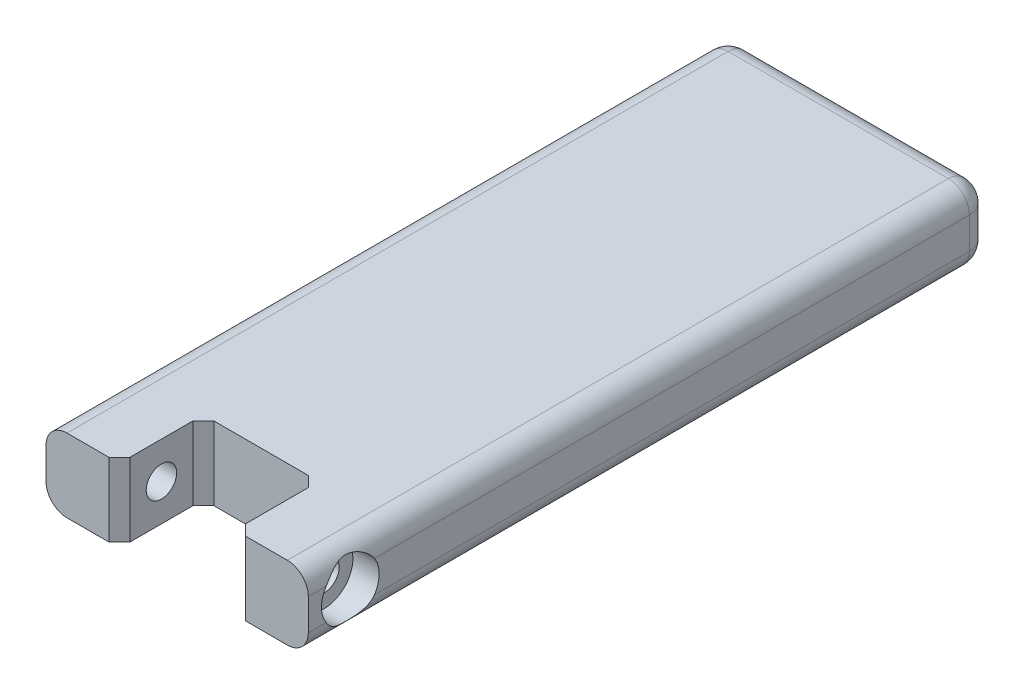
ISO-10303-21;
HEADER;
FILE_DESCRIPTION(('STEP AP214'),'2;1');
FILE_NAME('part.step','',(''),(''),'','','');
FILE_SCHEMA(('AUTOMOTIVE_DESIGN { 1 0 10303 214 1 1 1 1 }'));
ENDSEC;
DATA;
#1=APPLICATION_CONTEXT('core data for automotive mechanical design processes');
#2=APPLICATION_PROTOCOL_DEFINITION('international standard','automotive_design',2000,#1);
#3=PRODUCT_CONTEXT('',#1,'mechanical');
#4=PRODUCT('Part','Part','',(#3));
#5=PRODUCT_RELATED_PRODUCT_CATEGORY('part','',(#4));
#6=PRODUCT_DEFINITION_FORMATION('','',#4);
#7=PRODUCT_DEFINITION_CONTEXT('part definition',#1,'design');
#8=PRODUCT_DEFINITION('design','',#6,#7);
#9=PRODUCT_DEFINITION_SHAPE('','',#8);
#10=(LENGTH_UNIT() NAMED_UNIT(*) SI_UNIT(.MILLI.,.METRE.));
#11=(NAMED_UNIT(*) PLANE_ANGLE_UNIT() SI_UNIT($,.RADIAN.));
#12=(NAMED_UNIT(*) SI_UNIT($,.STERADIAN.) SOLID_ANGLE_UNIT());
#13=UNCERTAINTY_MEASURE_WITH_UNIT(LENGTH_MEASURE(1.E-05),#10,'distance_accuracy_value','');
#14=(GEOMETRIC_REPRESENTATION_CONTEXT(3) GLOBAL_UNCERTAINTY_ASSIGNED_CONTEXT((#13)) GLOBAL_UNIT_ASSIGNED_CONTEXT((#10,
#11,#12)) REPRESENTATION_CONTEXT('',''));
#15=CARTESIAN_POINT('',(0.,0.,0.));
#16=DIRECTION('',(0.,0.,1.));
#17=DIRECTION('',(1.,0.,0.));
#18=AXIS2_PLACEMENT_3D('',#15,#16,#17);
#19=CARTESIAN_POINT('',(12.5,-3.5,65.));
#20=DIRECTION('',(-1.,0.,0.));
#21=DIRECTION('',(0.,0.,1.));
#22=AXIS2_PLACEMENT_3D('',#19,#20,#21);
#23=PLANE('',#22);
#24=DIRECTION('',(0.,0.,-1.));
#25=VECTOR('',#24,1.);
#26=CARTESIAN_POINT('',(12.5,-1.5,65.));
#27=LINE('',#26,#25);
#28=CARTESIAN_POINT('',(12.5,-1.5,58.6951138856773));
#29=VERTEX_POINT('',#28);
#30=CARTESIAN_POINT('',(12.5,-1.5,2.));
#31=VERTEX_POINT('',#30);
#32=EDGE_CURVE('E250',#29,#31,#27,.T.);
#33=ORIENTED_EDGE('',*,*,#32,.T.);
#34=DIRECTION('',(0.,1.,0.));
#35=VECTOR('',#34,1.);
#36=CARTESIAN_POINT('',(12.5,1.5,2.));
#37=LINE('',#36,#35);
#38=CARTESIAN_POINT('',(12.5,1.5,2.));
#39=VERTEX_POINT('',#38);
#40=EDGE_CURVE('E355',#31,#39,#37,.T.);
#41=ORIENTED_EDGE('',*,*,#40,.T.);
#42=DIRECTION('',(0.,0.,-1.));
#43=VECTOR('',#42,1.);
#44=CARTESIAN_POINT('',(12.5,1.5,65.));
#45=LINE('',#44,#43);
#46=CARTESIAN_POINT('',(12.5,1.5,58.6951138856773));
#47=VERTEX_POINT('',#46);
#48=EDGE_CURVE('E258',#39,#47,#45,.F.);
#49=ORIENTED_EDGE('',*,*,#48,.T.);
#50=CARTESIAN_POINT('',(12.5,0.,61.0000000000006));
#51=DIRECTION('',(1.,0.,0.));
#52=DIRECTION('',(0.,0.,-1.));
#53=AXIS2_PLACEMENT_3D('',#50,#51,#52);
#54=CIRCLE('',#53,2.75);
#55=EDGE_CURVE('E358',#29,#47,#54,.T.);
#56=ORIENTED_EDGE('',*,*,#55,.F.);
#57=EDGE_LOOP('',(#33,#41,#49,#56));
#58=FACE_BOUND('',#57,.T.);
#59=ADVANCED_FACE('F35',(#58),#23,.F.);
#60=CARTESIAN_POINT('',(0.,0.,65.));
#61=DIRECTION('',(0.,0.,-1.));
#62=DIRECTION('',(-1.,0.,0.));
#63=AXIS2_PLACEMENT_3D('',#60,#61,#62);
#64=PLANE('',#63);
#65=DIRECTION('',(1.,0.,0.));
#66=VECTOR('',#65,1.);
#67=CARTESIAN_POINT('',(-12.5,-3.5,65.));
#68=LINE('',#67,#66);
#69=CARTESIAN_POINT('',(-10.5,-3.5,65.));
#70=VERTEX_POINT('',#69);
#71=CARTESIAN_POINT('',(-6.50000000000001,-3.5,65.));
#72=VERTEX_POINT('',#71);
#73=EDGE_CURVE('E220',#70,#72,#68,.T.);
#74=ORIENTED_EDGE('',*,*,#73,.T.);
#75=DIRECTION('',(0.,1.,0.));
#76=VECTOR('',#75,1.);
#77=CARTESIAN_POINT('',(-6.50000000000001,0.,65.));
#78=LINE('',#77,#76);
#79=CARTESIAN_POINT('',(-6.50000000000001,3.5,65.));
#80=VERTEX_POINT('',#79);
#81=EDGE_CURVE('E43',#72,#80,#78,.T.);
#82=ORIENTED_EDGE('',*,*,#81,.T.);
#83=DIRECTION('',(-1.,0.,0.));
#84=VECTOR('',#83,1.);
#85=CARTESIAN_POINT('',(-12.5,3.5,65.));
#86=LINE('',#85,#84);
#87=CARTESIAN_POINT('',(-10.5,3.5,65.));
#88=VERTEX_POINT('',#87);
#89=EDGE_CURVE('E212',#80,#88,#86,.T.);
#90=ORIENTED_EDGE('',*,*,#89,.T.);
#91=CARTESIAN_POINT('',(-10.5,1.5,65.));
#92=DIRECTION('',(0.,0.,-1.));
#93=DIRECTION('',(-1.,0.,0.));
#94=AXIS2_PLACEMENT_3D('',#91,#92,#93);
#95=CIRCLE('',#94,2.);
#96=CARTESIAN_POINT('',(-12.5,1.5,65.));
#97=VERTEX_POINT('',#96);
#98=EDGE_CURVE('E248',#88,#97,#95,.F.);
#99=ORIENTED_EDGE('',*,*,#98,.T.);
#100=DIRECTION('',(0.,-1.,0.));
#101=VECTOR('',#100,1.);
#102=CARTESIAN_POINT('',(-12.5,-3.5,65.));
#103=LINE('',#102,#101);
#104=CARTESIAN_POINT('',(-12.5,-1.5,65.));
#105=VERTEX_POINT('',#104);
#106=EDGE_CURVE('E216',#97,#105,#103,.T.);
#107=ORIENTED_EDGE('',*,*,#106,.T.);
#108=CARTESIAN_POINT('',(-10.5,-1.5,65.));
#109=DIRECTION('',(0.,0.,-1.));
#110=DIRECTION('',(-1.,0.,0.));
#111=AXIS2_PLACEMENT_3D('',#108,#109,#110);
#112=CIRCLE('',#111,2.);
#113=EDGE_CURVE('E246',#105,#70,#112,.F.);
#114=ORIENTED_EDGE('',*,*,#113,.T.);
#115=EDGE_LOOP('',(#74,#82,#90,#99,#107,#114));
#116=FACE_BOUND('',#115,.T.);
#117=ADVANCED_FACE('F310',(#116),#64,.F.);
#118=CARTESIAN_POINT('',(12.5,1.5,63.3048861143238));
#119=VERTEX_POINT('',#118);
#120=CARTESIAN_POINT('',(12.5,-1.5,63.3048861143238));
#121=VERTEX_POINT('',#120);
#122=EDGE_CURVE('E476',#119,#121,#54,.T.);
#123=ORIENTED_EDGE('',*,*,#122,.F.);
#124=DIRECTION('',(0.,0.,-1.));
#125=VECTOR('',#124,1.);
#126=CARTESIAN_POINT('',(12.5,1.5,65.));
#127=LINE('',#126,#125);
#128=CARTESIAN_POINT('',(12.5,1.5,65.));
#129=VERTEX_POINT('',#128);
#130=EDGE_CURVE('E256',#119,#129,#127,.F.);
#131=ORIENTED_EDGE('',*,*,#130,.T.);
#132=DIRECTION('',(0.,1.,0.));
#133=VECTOR('',#132,1.);
#134=CARTESIAN_POINT('',(12.5,-3.5,65.));
#135=LINE('',#134,#133);
#136=CARTESIAN_POINT('',(12.5,-1.5,65.));
#137=VERTEX_POINT('',#136);
#138=EDGE_CURVE('E209',#137,#129,#135,.T.);
#139=ORIENTED_EDGE('',*,*,#138,.F.);
#140=DIRECTION('',(0.,0.,-1.));
#141=VECTOR('',#140,1.);
#142=CARTESIAN_POINT('',(12.5,-1.5,65.));
#143=LINE('',#142,#141);
#144=EDGE_CURVE('E253',#137,#121,#143,.T.);
#145=ORIENTED_EDGE('',*,*,#144,.T.);
#146=EDGE_LOOP('',(#123,#131,#139,#145));
#147=FACE_BOUND('',#146,.T.);
#148=ADVANCED_FACE('F322',(#147),#23,.F.);
#149=CARTESIAN_POINT('',(-12.5,3.5,65.));
#150=DIRECTION('',(0.,-1.,0.));
#151=DIRECTION('',(0.,0.,-1.));
#152=AXIS2_PLACEMENT_3D('',#149,#150,#151);
#153=PLANE('',#152);
#154=DIRECTION('',(0.,0.,-1.));
#155=VECTOR('',#154,1.);
#156=CARTESIAN_POINT('',(5.5,3.5,65.));
#157=LINE('',#156,#155);
#158=CARTESIAN_POINT('',(5.5,3.5,64.));
#159=VERTEX_POINT('',#158);
#160=CARTESIAN_POINT('',(5.5,3.5,58.));
#161=VERTEX_POINT('',#160);
#162=EDGE_CURVE('E201',#159,#161,#157,.T.);
#163=ORIENTED_EDGE('',*,*,#162,.F.);
#164=DIRECTION('',(-0.707106781186545,0.,-0.70710678118655));
#165=VECTOR('',#164,1.);
#166=CARTESIAN_POINT('',(5.5,3.5,64.));
#167=LINE('',#166,#165);
#168=CARTESIAN_POINT('',(6.49999999999999,3.5,65.));
#169=VERTEX_POINT('',#168);
#170=EDGE_CURVE('E394',#159,#169,#167,.F.);
#171=ORIENTED_EDGE('',*,*,#170,.T.);
#172=CARTESIAN_POINT('',(10.5,3.5,65.));
#173=VERTEX_POINT('',#172);
#174=EDGE_CURVE('E213',#173,#169,#86,.T.);
#175=ORIENTED_EDGE('',*,*,#174,.F.);
#176=DIRECTION('',(0.,0.,-1.));
#177=VECTOR('',#176,1.);
#178=CARTESIAN_POINT('',(10.5,3.5,65.));
#179=LINE('',#178,#177);
#180=CARTESIAN_POINT('',(10.5,3.5,2.));
#181=VERTEX_POINT('',#180);
#182=EDGE_CURVE('E240',#173,#181,#179,.T.);
#183=ORIENTED_EDGE('',*,*,#182,.T.);
#184=DIRECTION('',(-1.,0.,0.));
#185=VECTOR('',#184,1.);
#186=CARTESIAN_POINT('',(-10.5,3.5,2.));
#187=LINE('',#186,#185);
#188=CARTESIAN_POINT('',(-10.5,3.5,2.));
#189=VERTEX_POINT('',#188);
#190=EDGE_CURVE('E407',#181,#189,#187,.T.);
#191=ORIENTED_EDGE('',*,*,#190,.T.);
#192=DIRECTION('',(0.,0.,-1.));
#193=VECTOR('',#192,1.);
#194=CARTESIAN_POINT('',(-10.5,3.5,65.));
#195=LINE('',#194,#193);
#196=EDGE_CURVE('E243',#189,#88,#195,.F.);
#197=ORIENTED_EDGE('',*,*,#196,.T.);
#198=ORIENTED_EDGE('',*,*,#89,.F.);
#199=DIRECTION('',(-0.70710678118654,0.,0.707106781186555));
#200=VECTOR('',#199,1.);
#201=CARTESIAN_POINT('',(-6.50000000000001,3.5,65.));
#202=LINE('',#201,#200);
#203=CARTESIAN_POINT('',(-5.50000000000001,3.5,64.));
#204=VERTEX_POINT('',#203);
#205=EDGE_CURVE('E391',#80,#204,#202,.F.);
#206=ORIENTED_EDGE('',*,*,#205,.T.);
#207=DIRECTION('',(0.,0.,1.));
#208=VECTOR('',#207,1.);
#209=CARTESIAN_POINT('',(-5.50000000000001,3.5,65.));
#210=LINE('',#209,#208);
#211=CARTESIAN_POINT('',(-5.50000000000001,3.5,58.));
#212=VERTEX_POINT('',#211);
#213=EDGE_CURVE('E205',#212,#204,#210,.T.);
#214=ORIENTED_EDGE('',*,*,#213,.F.);
#215=DIRECTION('',(-0.707106781186545,0.,0.70710678118655));
#216=VECTOR('',#215,1.);
#217=CARTESIAN_POINT('',(-12.5,3.5,65.));
#218=LINE('',#217,#216);
#219=CARTESIAN_POINT('',(-4.50000000000001,3.5,57.));
#220=VERTEX_POINT('',#219);
#221=EDGE_CURVE('E199',#212,#220,#218,.F.);
#222=ORIENTED_EDGE('',*,*,#221,.T.);
#223=DIRECTION('',(-1.,0.,0.));
#224=VECTOR('',#223,1.);
#225=CARTESIAN_POINT('',(-5.50000000000001,3.5,57.));
#226=LINE('',#225,#224);
#227=CARTESIAN_POINT('',(4.49999999999999,3.5,57.));
#228=VERTEX_POINT('',#227);
#229=EDGE_CURVE('E191',#228,#220,#226,.T.);
#230=ORIENTED_EDGE('',*,*,#229,.F.);
#231=DIRECTION('',(-0.70710678118655,0.,-0.707106781186545));
#232=VECTOR('',#231,1.);
#233=CARTESIAN_POINT('',(0.,3.5,52.5));
#234=LINE('',#233,#232);
#235=EDGE_CURVE('E174',#228,#161,#234,.F.);
#236=ORIENTED_EDGE('',*,*,#235,.T.);
#237=EDGE_LOOP('',(#163,#171,#175,#183,#191,#197,#198,#206,#214,#222,#230,#236));
#238=FACE_BOUND('',#237,.T.);
#239=ADVANCED_FACE('F197',(#238),#153,.F.);
#240=CARTESIAN_POINT('',(-12.5,-3.5,65.));
#241=DIRECTION('',(1.,0.,0.));
#242=DIRECTION('',(0.,0.,-1.));
#243=AXIS2_PLACEMENT_3D('',#240,#241,#242);
#244=PLANE('',#243);
#245=CARTESIAN_POINT('',(-12.5,0.,61.0000000000006));
#246=DIRECTION('',(1.,0.,0.));
#247=DIRECTION('',(0.,0.,-1.));
#248=AXIS2_PLACEMENT_3D('',#245,#246,#247);
#249=CIRCLE('',#248,1.44999999999999);
#250=CARTESIAN_POINT('',(-12.5,0.,59.5500000000006));
#251=VERTEX_POINT('',#250);
#252=EDGE_CURVE('E235',#251,#251,#249,.T.);
#253=ORIENTED_EDGE('',*,*,#252,.T.);
#254=EDGE_LOOP('',(#253));
#255=FACE_BOUND('',#254,.T.);
#256=DIRECTION('',(0.,0.,-1.));
#257=VECTOR('',#256,1.);
#258=CARTESIAN_POINT('',(-12.5,1.5,65.));
#259=LINE('',#258,#257);
#260=CARTESIAN_POINT('',(-12.5,1.5,2.));
#261=VERTEX_POINT('',#260);
#262=EDGE_CURVE('E237',#97,#261,#259,.T.);
#263=ORIENTED_EDGE('',*,*,#262,.T.);
#264=DIRECTION('',(0.,-1.,0.));
#265=VECTOR('',#264,1.);
#266=CARTESIAN_POINT('',(-12.5,-1.5,2.));
#267=LINE('',#266,#265);
#268=CARTESIAN_POINT('',(-12.5,-1.5,2.));
#269=VERTEX_POINT('',#268);
#270=EDGE_CURVE('E392',#261,#269,#267,.T.);
#271=ORIENTED_EDGE('',*,*,#270,.T.);
#272=DIRECTION('',(0.,0.,-1.));
#273=VECTOR('',#272,1.);
#274=CARTESIAN_POINT('',(-12.5,-1.5,65.));
#275=LINE('',#274,#273);
#276=EDGE_CURVE('E230',#269,#105,#275,.F.);
#277=ORIENTED_EDGE('',*,*,#276,.T.);
#278=ORIENTED_EDGE('',*,*,#106,.F.);
#279=EDGE_LOOP('',(#263,#271,#277,#278));
#280=FACE_BOUND('',#279,.T.);
#281=ADVANCED_FACE('F316',(#255,#280),#244,.F.);
#282=CARTESIAN_POINT('',(-12.5,-3.5,65.));
#283=DIRECTION('',(0.,1.,0.));
#284=DIRECTION('',(0.,0.,1.));
#285=AXIS2_PLACEMENT_3D('',#282,#283,#284);
#286=PLANE('',#285);
#287=CARTESIAN_POINT('',(6.49999999999999,-3.5,65.));
#288=VERTEX_POINT('',#287);
#289=CARTESIAN_POINT('',(10.5,-3.5,65.));
#290=VERTEX_POINT('',#289);
#291=EDGE_CURVE('E219',#288,#290,#68,.T.);
#292=ORIENTED_EDGE('',*,*,#291,.F.);
#293=DIRECTION('',(0.707106781186545,0.,0.70710678118655));
#294=VECTOR('',#293,1.);
#295=CARTESIAN_POINT('',(5.5,-3.5,64.));
#296=LINE('',#295,#294);
#297=CARTESIAN_POINT('',(5.5,-3.5,64.));
#298=VERTEX_POINT('',#297);
#299=EDGE_CURVE('E399',#288,#298,#296,.F.);
#300=ORIENTED_EDGE('',*,*,#299,.T.);
#301=DIRECTION('',(0.,0.,-1.));
#302=VECTOR('',#301,1.);
#303=CARTESIAN_POINT('',(5.5,-3.5,65.));
#304=LINE('',#303,#302);
#305=CARTESIAN_POINT('',(5.5,-3.5,58.));
#306=VERTEX_POINT('',#305);
#307=EDGE_CURVE('E203',#298,#306,#304,.T.);
#308=ORIENTED_EDGE('',*,*,#307,.T.);
#309=DIRECTION('',(0.70710678118655,0.,0.707106781186545));
#310=VECTOR('',#309,1.);
#311=CARTESIAN_POINT('',(0.,-3.5,52.5));
#312=LINE('',#311,#310);
#313=CARTESIAN_POINT('',(4.49999999999999,-3.5,57.));
#314=VERTEX_POINT('',#313);
#315=EDGE_CURVE('E184',#306,#314,#312,.F.);
#316=ORIENTED_EDGE('',*,*,#315,.T.);
#317=DIRECTION('',(-1.,0.,0.));
#318=VECTOR('',#317,1.);
#319=CARTESIAN_POINT('',(-5.50000000000001,-3.5,57.));
#320=LINE('',#319,#318);
#321=CARTESIAN_POINT('',(-4.50000000000001,-3.5,57.));
#322=VERTEX_POINT('',#321);
#323=EDGE_CURVE('E194',#314,#322,#320,.T.);
#324=ORIENTED_EDGE('',*,*,#323,.T.);
#325=DIRECTION('',(0.707106781186545,0.,-0.70710678118655));
#326=VECTOR('',#325,1.);
#327=CARTESIAN_POINT('',(-12.5,-3.5,65.));
#328=LINE('',#327,#326);
#329=CARTESIAN_POINT('',(-5.50000000000001,-3.5,58.));
#330=VERTEX_POINT('',#329);
#331=EDGE_CURVE('E228',#322,#330,#328,.F.);
#332=ORIENTED_EDGE('',*,*,#331,.T.);
#333=DIRECTION('',(0.,0.,1.));
#334=VECTOR('',#333,1.);
#335=CARTESIAN_POINT('',(-5.50000000000001,-3.5,65.));
#336=LINE('',#335,#334);
#337=CARTESIAN_POINT('',(-5.50000000000001,-3.5,64.));
#338=VERTEX_POINT('',#337);
#339=EDGE_CURVE('E200',#330,#338,#336,.T.);
#340=ORIENTED_EDGE('',*,*,#339,.T.);
#341=DIRECTION('',(0.70710678118654,0.,-0.707106781186555));
#342=VECTOR('',#341,1.);
#343=CARTESIAN_POINT('',(-6.50000000000001,-3.5,65.));
#344=LINE('',#343,#342);
#345=EDGE_CURVE('E50',#338,#72,#344,.F.);
#346=ORIENTED_EDGE('',*,*,#345,.T.);
#347=ORIENTED_EDGE('',*,*,#73,.F.);
#348=DIRECTION('',(0.,0.,-1.));
#349=VECTOR('',#348,1.);
#350=CARTESIAN_POINT('',(-10.5,-3.5,65.));
#351=LINE('',#350,#349);
#352=CARTESIAN_POINT('',(-10.5,-3.5,2.));
#353=VERTEX_POINT('',#352);
#354=EDGE_CURVE('E428',#70,#353,#351,.T.);
#355=ORIENTED_EDGE('',*,*,#354,.T.);
#356=DIRECTION('',(1.,0.,0.));
#357=VECTOR('',#356,1.);
#358=CARTESIAN_POINT('',(10.5,-3.5,2.));
#359=LINE('',#358,#357);
#360=CARTESIAN_POINT('',(10.5,-3.5,2.));
#361=VERTEX_POINT('',#360);
#362=EDGE_CURVE('E427',#353,#361,#359,.T.);
#363=ORIENTED_EDGE('',*,*,#362,.T.);
#364=DIRECTION('',(0.,0.,-1.));
#365=VECTOR('',#364,1.);
#366=CARTESIAN_POINT('',(10.5,-3.5,65.));
#367=LINE('',#366,#365);
#368=EDGE_CURVE('E465',#361,#290,#367,.F.);
#369=ORIENTED_EDGE('',*,*,#368,.T.);
#370=EDGE_LOOP('',(#292,#300,#308,#316,#324,#332,#340,#346,#347,#355,#363,#369));
#371=FACE_BOUND('',#370,.T.);
#372=ADVANCED_FACE('F308',(#371),#286,.F.);
#373=ORIENTED_EDGE('',*,*,#174,.T.);
#374=DIRECTION('',(0.,-1.,0.));
#375=VECTOR('',#374,1.);
#376=CARTESIAN_POINT('',(6.49999999999999,0.,65.));
#377=LINE('',#376,#375);
#378=EDGE_CURVE('E396',#169,#288,#377,.T.);
#379=ORIENTED_EDGE('',*,*,#378,.T.);
#380=ORIENTED_EDGE('',*,*,#291,.T.);
#381=CARTESIAN_POINT('',(10.5,-1.5,65.));
#382=DIRECTION('',(0.,0.,-1.));
#383=DIRECTION('',(-1.,0.,0.));
#384=AXIS2_PLACEMENT_3D('',#381,#382,#383);
#385=CIRCLE('',#384,2.);
#386=EDGE_CURVE('E469',#290,#137,#385,.F.);
#387=ORIENTED_EDGE('',*,*,#386,.T.);
#388=ORIENTED_EDGE('',*,*,#138,.T.);
#389=CARTESIAN_POINT('',(10.5,1.5,65.));
#390=DIRECTION('',(0.,0.,-1.));
#391=DIRECTION('',(-1.,0.,0.));
#392=AXIS2_PLACEMENT_3D('',#389,#390,#391);
#393=CIRCLE('',#392,2.);
#394=EDGE_CURVE('E468',#129,#173,#393,.F.);
#395=ORIENTED_EDGE('',*,*,#394,.T.);
#396=EDGE_LOOP('',(#373,#379,#380,#387,#388,#395));
#397=FACE_BOUND('',#396,.T.);
#398=ADVANCED_FACE('F305',(#397),#64,.F.);
#399=CARTESIAN_POINT('',(0.,0.,0.));
#400=DIRECTION('',(0.,0.,-1.));
#401=DIRECTION('',(-1.,0.,0.));
#402=AXIS2_PLACEMENT_3D('',#399,#400,#401);
#403=PLANE('',#402);
#404=DIRECTION('',(0.,1.,0.));
#405=VECTOR('',#404,1.);
#406=CARTESIAN_POINT('',(10.5,-1.5,0.));
#407=LINE('',#406,#405);
#408=CARTESIAN_POINT('',(10.5,1.5,0.));
#409=VERTEX_POINT('',#408);
#410=CARTESIAN_POINT('',(10.5,-1.5,0.));
#411=VERTEX_POINT('',#410);
#412=EDGE_CURVE('E445',#409,#411,#407,.F.);
#413=ORIENTED_EDGE('',*,*,#412,.T.);
#414=DIRECTION('',(1.,0.,0.));
#415=VECTOR('',#414,1.);
#416=CARTESIAN_POINT('',(-10.5,-1.5,0.));
#417=LINE('',#416,#415);
#418=CARTESIAN_POINT('',(-10.5,-1.5,0.));
#419=VERTEX_POINT('',#418);
#420=EDGE_CURVE('E444',#411,#419,#417,.F.);
#421=ORIENTED_EDGE('',*,*,#420,.T.);
#422=DIRECTION('',(0.,-1.,0.));
#423=VECTOR('',#422,1.);
#424=CARTESIAN_POINT('',(-10.5,1.5,0.));
#425=LINE('',#424,#423);
#426=CARTESIAN_POINT('',(-10.5,1.5,0.));
#427=VERTEX_POINT('',#426);
#428=EDGE_CURVE('E434',#419,#427,#425,.F.);
#429=ORIENTED_EDGE('',*,*,#428,.T.);
#430=DIRECTION('',(-1.,0.,0.));
#431=VECTOR('',#430,1.);
#432=CARTESIAN_POINT('',(10.5,1.5,0.));
#433=LINE('',#432,#431);
#434=EDGE_CURVE('E448',#427,#409,#433,.F.);
#435=ORIENTED_EDGE('',*,*,#434,.T.);
#436=EDGE_LOOP('',(#413,#421,#429,#435));
#437=FACE_BOUND('',#436,.T.);
#438=ADVANCED_FACE('F303',(#437),#403,.T.);
#439=CARTESIAN_POINT('',(-5.50000000000001,-3.5,65.));
#440=DIRECTION('',(-1.,0.,0.));
#441=DIRECTION('',(0.,0.,1.));
#442=AXIS2_PLACEMENT_3D('',#439,#440,#441);
#443=PLANE('',#442);
#444=CARTESIAN_POINT('',(-5.50000000000001,0.,61.0000000000006));
#445=DIRECTION('',(-1.,0.,0.));
#446=DIRECTION('',(0.,0.,1.));
#447=AXIS2_PLACEMENT_3D('',#444,#445,#446);
#448=CIRCLE('',#447,1.45);
#449=CARTESIAN_POINT('',(-5.50000000000001,0.,62.4500000000006));
#450=VERTEX_POINT('',#449);
#451=EDGE_CURVE('E234',#450,#450,#448,.T.);
#452=ORIENTED_EDGE('',*,*,#451,.T.);
#453=EDGE_LOOP('',(#452));
#454=FACE_BOUND('',#453,.T.);
#455=ORIENTED_EDGE('',*,*,#213,.T.);
#456=DIRECTION('',(0.,-1.,0.));
#457=VECTOR('',#456,1.);
#458=CARTESIAN_POINT('',(-5.50000000000001,-3.5,64.));
#459=LINE('',#458,#457);
#460=EDGE_CURVE('E11',#204,#338,#459,.T.);
#461=ORIENTED_EDGE('',*,*,#460,.T.);
#462=ORIENTED_EDGE('',*,*,#339,.F.);
#463=DIRECTION('',(0.,1.,0.));
#464=VECTOR('',#463,1.);
#465=CARTESIAN_POINT('',(-5.50000000000001,3.5,58.));
#466=LINE('',#465,#464);
#467=EDGE_CURVE('E185',#330,#212,#466,.T.);
#468=ORIENTED_EDGE('',*,*,#467,.T.);
#469=EDGE_LOOP('',(#455,#461,#462,#468));
#470=FACE_BOUND('',#469,.T.);
#471=ADVANCED_FACE('F297',(#454,#470),#443,.F.);
#472=CARTESIAN_POINT('',(-5.50000000000001,-3.5,57.));
#473=DIRECTION('',(0.,0.,-1.));
#474=DIRECTION('',(-1.,0.,0.));
#475=AXIS2_PLACEMENT_3D('',#472,#473,#474);
#476=PLANE('',#475);
#477=ORIENTED_EDGE('',*,*,#323,.F.);
#478=DIRECTION('',(0.,1.,0.));
#479=VECTOR('',#478,1.);
#480=CARTESIAN_POINT('',(4.49999999999999,3.5,57.));
#481=LINE('',#480,#479);
#482=EDGE_CURVE('E178',#314,#228,#481,.T.);
#483=ORIENTED_EDGE('',*,*,#482,.T.);
#484=ORIENTED_EDGE('',*,*,#229,.T.);
#485=DIRECTION('',(0.,-1.,0.));
#486=VECTOR('',#485,1.);
#487=CARTESIAN_POINT('',(-4.50000000000001,-3.5,57.));
#488=LINE('',#487,#486);
#489=EDGE_CURVE('E195',#220,#322,#488,.T.);
#490=ORIENTED_EDGE('',*,*,#489,.T.);
#491=EDGE_LOOP('',(#477,#483,#484,#490));
#492=FACE_BOUND('',#491,.T.);
#493=ADVANCED_FACE('F190',(#492),#476,.F.);
#494=CARTESIAN_POINT('',(5.5,-3.5,65.));
#495=DIRECTION('',(1.,0.,0.));
#496=DIRECTION('',(0.,0.,-1.));
#497=AXIS2_PLACEMENT_3D('',#494,#495,#496);
#498=PLANE('',#497);
#499=CARTESIAN_POINT('',(5.5,0.,61.0000000000006));
#500=DIRECTION('',(1.,0.,0.));
#501=DIRECTION('',(0.,0.,-1.));
#502=AXIS2_PLACEMENT_3D('',#499,#500,#501);
#503=CIRCLE('',#502,1.45);
#504=CARTESIAN_POINT('',(5.5,0.,59.5500000000006));
#505=VERTEX_POINT('',#504);
#506=EDGE_CURVE('E231',#505,#505,#503,.T.);
#507=ORIENTED_EDGE('',*,*,#506,.T.);
#508=EDGE_LOOP('',(#507));
#509=FACE_BOUND('',#508,.T.);
#510=ORIENTED_EDGE('',*,*,#307,.F.);
#511=DIRECTION('',(0.,1.,0.));
#512=VECTOR('',#511,1.);
#513=CARTESIAN_POINT('',(5.5,-3.5,64.));
#514=LINE('',#513,#512);
#515=EDGE_CURVE('E388',#298,#159,#514,.T.);
#516=ORIENTED_EDGE('',*,*,#515,.T.);
#517=ORIENTED_EDGE('',*,*,#162,.T.);
#518=DIRECTION('',(0.,-1.,0.));
#519=VECTOR('',#518,1.);
#520=CARTESIAN_POINT('',(5.5,-3.5,58.));
#521=LINE('',#520,#519);
#522=EDGE_CURVE('E180',#161,#306,#521,.T.);
#523=ORIENTED_EDGE('',*,*,#522,.T.);
#524=EDGE_LOOP('',(#510,#516,#517,#523));
#525=FACE_BOUND('',#524,.T.);
#526=ADVANCED_FACE('F296',(#509,#525),#498,.F.);
#527=CARTESIAN_POINT('',(4.49999999999999,-3.5,57.));
#528=DIRECTION('',(-0.707106781186545,0.,0.70710678118655));
#529=DIRECTION('',(0.,-1.,0.));
#530=AXIS2_PLACEMENT_3D('',#527,#528,#529);
#531=PLANE('',#530);
#532=ORIENTED_EDGE('',*,*,#315,.F.);
#533=ORIENTED_EDGE('',*,*,#522,.F.);
#534=ORIENTED_EDGE('',*,*,#235,.F.);
#535=ORIENTED_EDGE('',*,*,#482,.F.);
#536=EDGE_LOOP('',(#532,#533,#534,#535));
#537=FACE_BOUND('',#536,.T.);
#538=ADVANCED_FACE('F177',(#537),#531,.T.);
#539=CARTESIAN_POINT('',(-5.50000000000001,-3.5,58.));
#540=DIRECTION('',(0.70710678118655,0.,0.707106781186545));
#541=DIRECTION('',(0.,-1.,0.));
#542=AXIS2_PLACEMENT_3D('',#539,#540,#541);
#543=PLANE('',#542);
#544=ORIENTED_EDGE('',*,*,#331,.F.);
#545=ORIENTED_EDGE('',*,*,#489,.F.);
#546=ORIENTED_EDGE('',*,*,#221,.F.);
#547=ORIENTED_EDGE('',*,*,#467,.F.);
#548=EDGE_LOOP('',(#544,#545,#546,#547));
#549=FACE_BOUND('',#548,.T.);
#550=ADVANCED_FACE('F282',(#549),#543,.T.);
#551=CARTESIAN_POINT('',(12.5,0.,61.0000000000006));
#552=DIRECTION('',(1.,0.,0.));
#553=DIRECTION('',(0.,0.,-1.));
#554=AXIS2_PLACEMENT_3D('',#551,#552,#553);
#555=CYLINDRICAL_SURFACE('',#554,2.75);
#556=CARTESIAN_POINT('',(9.99999999999999,0.,61.0000000000006));
#557=DIRECTION('',(1.,0.,0.));
#558=DIRECTION('',(0.,0.,-1.));
#559=AXIS2_PLACEMENT_3D('',#556,#557,#558);
#560=CIRCLE('',#559,2.75);
#561=CARTESIAN_POINT('',(9.99999999999999,0.,58.2500000000006));
#562=VERTEX_POINT('',#561);
#563=EDGE_CURVE('E479',#562,#562,#560,.T.);
#564=ORIENTED_EDGE('',*,*,#563,.F.);
#565=EDGE_LOOP('',(#564));
#566=FACE_BOUND('',#565,.T.);
#567=ORIENTED_EDGE('',*,*,#55,.T.);
#568=CARTESIAN_POINT('',(12.5,1.5,58.6951138856773));
#569=CARTESIAN_POINT('',(12.5000031455247,1.55654719040747,58.7318984039466));
#570=CARTESIAN_POINT('',(12.4976030423075,1.61168036140283,58.7707552005851));
#571=CARTESIAN_POINT('',(12.4887327039993,1.71866391916391,58.8521673438518));
#572=CARTESIAN_POINT('',(12.4822692231237,1.77051959672422,58.8947164520887));
#573=CARTESIAN_POINT('',(12.4660769723939,1.87023190709926,58.9827929500595));
#574=CARTESIAN_POINT('',(12.4563781599825,1.91812037296952,59.0282900375119));
#575=CARTESIAN_POINT('',(12.4344014916754,2.01022961709538,59.1222858032058));
#576=CARTESIAN_POINT('',(12.4221225443847,2.05444883218452,59.1707857455091));
#577=CARTESIAN_POINT('',(12.3826073001845,2.18084035421773,59.3197304743795));
#578=CARTESIAN_POINT('',(12.3525619459295,2.25743750555092,59.4242350740885));
#579=CARTESIAN_POINT('',(12.2900544015329,2.39524100849854,59.6427488315061));
#580=CARTESIAN_POINT('',(12.2575824702803,2.45638047473159,59.7567965448156));
#581=CARTESIAN_POINT('',(12.1890009678127,2.57370289713175,60.0185688398604));
#582=CARTESIAN_POINT('',(12.1535974487112,2.62603303821094,60.1682811403763));
#583=CARTESIAN_POINT('',(12.1114688180424,2.684796803544,60.3994374522932));
#584=CARTESIAN_POINT('',(12.0992647544686,2.70108714983043,60.4774745684307));
#585=CARTESIAN_POINT('',(12.0795714424915,2.72687504946342,60.6352676493729));
#586=CARTESIAN_POINT('',(12.0720805471391,2.73637497578302,60.7150230036771));
#587=CARTESIAN_POINT('',(12.0631457118318,2.74764546944497,60.8659201144764));
#588=CARTESIAN_POINT('',(12.0610929340044,2.75019531169201,60.9369687145244));
#589=CARTESIAN_POINT('',(12.0614247125385,2.74978139960178,61.079036765408));
#590=CARTESIAN_POINT('',(12.0638089539989,2.74681803654397,61.1500562179544));
#591=CARTESIAN_POINT('',(12.0728200507609,2.73543063833604,61.2914746121209));
#592=CARTESIAN_POINT('',(12.0794524513349,2.72699946568053,61.3618726206057));
#593=CARTESIAN_POINT('',(12.0964251242216,2.70483145596675,61.5013844965903));
#594=CARTESIAN_POINT('',(12.1067676975421,2.69109132594348,61.5704975391278));
#595=CARTESIAN_POINT('',(12.144341342272,2.63932960387621,61.7872123800287));
#596=CARTESIAN_POINT('',(12.1771439150733,2.59173999499549,61.9316954856691));
#597=CARTESIAN_POINT('',(12.230275173944,2.5036539264582,62.1401544704469));
#598=CARTESIAN_POINT('',(12.2486732126794,2.47144240385069,62.208367095464));
#599=CARTESIAN_POINT('',(12.2857040022015,2.40157059789061,62.341876870298));
#600=CARTESIAN_POINT('',(12.3043367524611,2.36391032677159,62.4071740266602));
#601=CARTESIAN_POINT('',(12.359683505685,2.24140451758166,62.6006724188742));
#602=CARTESIAN_POINT('',(12.3951674318541,2.14804128636941,62.7240867840377));
#603=CARTESIAN_POINT('',(12.4391492572644,1.99254088535831,62.8969102874381));
#604=CARTESIAN_POINT('',(12.4522530154153,1.93824915848588,62.9523747090673));
#605=CARTESIAN_POINT('',(12.4743077235745,1.82471924321774,63.0588680959766));
#606=CARTESIAN_POINT('',(12.4832629090084,1.76548617287079,63.1099015415386));
#607=CARTESIAN_POINT('',(12.4929285728009,1.67124019405485,63.1843086442353));
#608=CARTESIAN_POINT('',(12.4955363567126,1.63781976970447,63.2094790937419));
#609=CARTESIAN_POINT('',(12.4990728191799,1.5697796951472,63.2583286098165));
#610=CARTESIAN_POINT('',(12.5000001080821,1.53515907654759,63.2820064264794));
#611=CARTESIAN_POINT('',(12.5,1.5,63.3048861143238));
#612=B_SPLINE_CURVE_WITH_KNOTS('',3,(#568,#569,#570,#571,#572,#573,#574,#575,#576,#577,#578,
#579,#580,#581,#582,#583,#584,#585,#586,#587,#588,#589,#590,#591,#592,#593,#594,#595,#596,#597,
#598,#599,#600,#601,#602,#603,#604,#605,#606,#607,#608,#609,#610,#611),.UNSPECIFIED.,.F.,.F.,(4,
2,2,2,2,2,2,2,2,2,2,2,2,2,2,2,2,2,2,2,2,4),(0.,0.202207318065058,0.404079409178726,
0.604131887594806,0.804269159006676,1.20177087458337,1.60096422595491,2.08548459343882,
2.32707444122813,2.56857982195211,2.78161011892903,2.994625297441,3.2079191004391,
3.42134541523356,3.88535369353777,4.11811425556194,4.3508742949995,4.82436255292688,
5.06021259924734,5.2958213243026,5.42151284487231,5.54730825630763),.UNSPECIFIED.);
#613=EDGE_CURVE('E267',#47,#119,#612,.T.);
#614=ORIENTED_EDGE('',*,*,#613,.T.);
#615=ORIENTED_EDGE('',*,*,#122,.T.);
#616=CARTESIAN_POINT('',(12.5,-1.5,63.3048861143238));
#617=CARTESIAN_POINT('',(12.5000031455247,-1.55654719040747,63.2681015960545));
#618=CARTESIAN_POINT('',(12.4976030423075,-1.61168036140284,63.229244799416));
#619=CARTESIAN_POINT('',(12.4887327039993,-1.71866391916392,63.1478326561493));
#620=CARTESIAN_POINT('',(12.4822692231237,-1.77051959672422,63.1052835479124));
#621=CARTESIAN_POINT('',(12.4660769723939,-1.87023190709926,63.0172070499416));
#622=CARTESIAN_POINT('',(12.4563781599825,-1.91812037296953,62.9717099624892));
#623=CARTESIAN_POINT('',(12.4344014916754,-2.01022961709538,62.8777141967953));
#624=CARTESIAN_POINT('',(12.4221225443847,-2.05444883218452,62.829214254492));
#625=CARTESIAN_POINT('',(12.3826073001845,-2.18084035421773,62.6802695256216));
#626=CARTESIAN_POINT('',(12.3525619459295,-2.25743750555092,62.5757649259126));
#627=CARTESIAN_POINT('',(12.2900544015329,-2.39524100849854,62.357251168495));
#628=CARTESIAN_POINT('',(12.2575824702803,-2.45638047473159,62.2432034551855));
#629=CARTESIAN_POINT('',(12.1890009678127,-2.57370289713175,61.9814311601407));
#630=CARTESIAN_POINT('',(12.1535974487112,-2.62603303821094,61.8317188596248));
#631=CARTESIAN_POINT('',(12.1114688180424,-2.684796803544,61.6005625477079));
#632=CARTESIAN_POINT('',(12.0992647544686,-2.70108714983043,61.5225254315704));
#633=CARTESIAN_POINT('',(12.0795714424916,-2.72687504946342,61.3647323506282));
#634=CARTESIAN_POINT('',(12.0720805471391,-2.73637497578302,61.284976996324));
#635=CARTESIAN_POINT('',(12.0631457118318,-2.74764546944497,61.1340798855246));
#636=CARTESIAN_POINT('',(12.0610929340044,-2.75019531169201,61.0630312854767));
#637=CARTESIAN_POINT('',(12.0614247125385,-2.74978139960178,60.9209632345931));
#638=CARTESIAN_POINT('',(12.0638089539989,-2.74681803654396,60.8499437820466));
#639=CARTESIAN_POINT('',(12.0728200507609,-2.73543063833603,60.7085253878801));
#640=CARTESIAN_POINT('',(12.0794524513349,-2.72699946568053,60.6381273793954));
#641=CARTESIAN_POINT('',(12.0964251242216,-2.70483145596675,60.4986155034108));
#642=CARTESIAN_POINT('',(12.1067676975421,-2.69109132594348,60.4295024608732));
#643=CARTESIAN_POINT('',(12.144341342272,-2.6393296038762,60.2127876199724));
#644=CARTESIAN_POINT('',(12.1771439150733,-2.59173999499547,60.0683045143319));
#645=CARTESIAN_POINT('',(12.2302751739441,-2.50365392645819,59.8598455295542));
#646=CARTESIAN_POINT('',(12.2486732126794,-2.47144240385068,59.7916329045371));
#647=CARTESIAN_POINT('',(12.2857040022015,-2.4015705978906,59.6581231297031));
#648=CARTESIAN_POINT('',(12.3043367524611,-2.36391032677158,59.5928259733408));
#649=CARTESIAN_POINT('',(12.359683505685,-2.24140451758164,59.3993275811268));
#650=CARTESIAN_POINT('',(12.3951674318541,-2.1480412863694,59.2759132159634));
#651=CARTESIAN_POINT('',(12.4391492572644,-1.9925408853583,59.103089712563));
#652=CARTESIAN_POINT('',(12.4522530154153,-1.93824915848586,59.0476252909338));
#653=CARTESIAN_POINT('',(12.4743077235745,-1.82471924321772,58.9411319040245));
#654=CARTESIAN_POINT('',(12.4832629090084,-1.76548617287077,58.8900984584625));
#655=CARTESIAN_POINT('',(12.4929285728009,-1.67124019405483,58.8156913557658));
#656=CARTESIAN_POINT('',(12.4955363567126,-1.63781976970446,58.7905209062592));
#657=CARTESIAN_POINT('',(12.4990728191799,-1.56977969514719,58.7416713901846));
#658=CARTESIAN_POINT('',(12.5000001080821,-1.53515907654759,58.7179935735217));
#659=CARTESIAN_POINT('',(12.5,-1.5,58.6951138856773));
#660=B_SPLINE_CURVE_WITH_KNOTS('',3,(#616,#617,#618,#619,#620,#621,#622,#623,#624,#625,#626,
#627,#628,#629,#630,#631,#632,#633,#634,#635,#636,#637,#638,#639,#640,#641,#642,#643,#644,#645,
#646,#647,#648,#649,#650,#651,#652,#653,#654,#655,#656,#657,#658,#659),.UNSPECIFIED.,.F.,.F.,(4,
2,2,2,2,2,2,2,2,2,2,2,2,2,2,2,2,2,2,2,2,4),(0.,0.202207318065069,0.404079409178731,
0.604131887594807,0.804269159006677,1.20177087458337,1.60096422595491,2.08548459343883,
2.32707444122814,2.56857982195212,2.78161011892904,2.99462529744102,3.20791910043911,
3.42134541523357,3.88535369353779,4.11811425556195,4.35087429499951,4.8243625529269,
5.06021259924734,5.29582132430261,5.42151284487231,5.54730825630761),.UNSPECIFIED.);
#661=EDGE_CURVE('E260',#121,#29,#660,.T.);
#662=ORIENTED_EDGE('',*,*,#661,.T.);
#663=EDGE_LOOP('',(#567,#614,#615,#662));
#664=FACE_BOUND('',#663,.T.);
#665=ADVANCED_FACE('F277',(#566,#664),#555,.F.);
#666=CARTESIAN_POINT('',(9.99999999999999,1.45,61.0000000000006));
#667=DIRECTION('',(-1.,0.,0.));
#668=DIRECTION('',(0.,0.,1.));
#669=AXIS2_PLACEMENT_3D('',#666,#667,#668);
#670=PLANE('',#669);
#671=CARTESIAN_POINT('',(9.99999999999999,0.,61.0000000000006));
#672=DIRECTION('',(1.,0.,0.));
#673=DIRECTION('',(0.,0.,-1.));
#674=AXIS2_PLACEMENT_3D('',#671,#672,#673);
#675=CIRCLE('',#674,1.45);
#676=CARTESIAN_POINT('',(9.99999999999999,0.,59.5500000000006));
#677=VERTEX_POINT('',#676);
#678=EDGE_CURVE('E499',#677,#677,#675,.T.);
#679=ORIENTED_EDGE('',*,*,#678,.F.);
#680=EDGE_LOOP('',(#679));
#681=FACE_BOUND('',#680,.T.);
#682=ORIENTED_EDGE('',*,*,#563,.T.);
#683=EDGE_LOOP('',(#682));
#684=FACE_BOUND('',#683,.T.);
#685=ADVANCED_FACE('F281',(#681,#684),#670,.F.);
#686=CARTESIAN_POINT('',(12.5,0.,61.0000000000006));
#687=DIRECTION('',(1.,0.,0.));
#688=DIRECTION('',(0.,0.,-1.));
#689=AXIS2_PLACEMENT_3D('',#686,#687,#688);
#690=CYLINDRICAL_SURFACE('',#689,1.45);
#691=ORIENTED_EDGE('',*,*,#678,.T.);
#692=EDGE_LOOP('',(#691));
#693=FACE_BOUND('',#692,.T.);
#694=ORIENTED_EDGE('',*,*,#506,.F.);
#695=EDGE_LOOP('',(#694));
#696=FACE_BOUND('',#695,.T.);
#697=ADVANCED_FACE('F287',(#693,#696),#690,.F.);
#698=ORIENTED_EDGE('',*,*,#252,.F.);
#699=EDGE_LOOP('',(#698));
#700=FACE_BOUND('',#699,.T.);
#701=ORIENTED_EDGE('',*,*,#451,.F.);
#702=EDGE_LOOP('',(#701));
#703=FACE_BOUND('',#702,.T.);
#704=ADVANCED_FACE('F289',(#700,#703),#690,.F.);
#705=CARTESIAN_POINT('',(-10.5,1.5,65.));
#706=DIRECTION('',(0.,0.,-1.));
#707=DIRECTION('',(-1.,0.,0.));
#708=AXIS2_PLACEMENT_3D('',#705,#706,#707);
#709=CYLINDRICAL_SURFACE('',#708,2.);
#710=ORIENTED_EDGE('',*,*,#196,.F.);
#711=CARTESIAN_POINT('',(-10.5,1.5,2.));
#712=DIRECTION('',(0.,0.,-1.));
#713=DIRECTION('',(-1.,0.,0.));
#714=AXIS2_PLACEMENT_3D('',#711,#712,#713);
#715=CIRCLE('',#714,2.);
#716=EDGE_CURVE('E453',#189,#261,#715,.F.);
#717=ORIENTED_EDGE('',*,*,#716,.T.);
#718=ORIENTED_EDGE('',*,*,#262,.F.);
#719=ORIENTED_EDGE('',*,*,#98,.F.);
#720=EDGE_LOOP('',(#710,#717,#718,#719));
#721=FACE_BOUND('',#720,.T.);
#722=ADVANCED_FACE('F292',(#721),#709,.T.);
#723=CARTESIAN_POINT('',(10.5,1.5,65.));
#724=DIRECTION('',(0.,0.,-1.));
#725=DIRECTION('',(-1.,0.,0.));
#726=AXIS2_PLACEMENT_3D('',#723,#724,#725);
#727=CYLINDRICAL_SURFACE('',#726,2.);
#728=ORIENTED_EDGE('',*,*,#48,.F.);
#729=CARTESIAN_POINT('',(10.5,1.5,2.));
#730=DIRECTION('',(0.,0.,-1.));
#731=DIRECTION('',(-1.,0.,0.));
#732=AXIS2_PLACEMENT_3D('',#729,#730,#731);
#733=CIRCLE('',#732,2.);
#734=EDGE_CURVE('E369',#39,#181,#733,.F.);
#735=ORIENTED_EDGE('',*,*,#734,.T.);
#736=ORIENTED_EDGE('',*,*,#182,.F.);
#737=ORIENTED_EDGE('',*,*,#394,.F.);
#738=ORIENTED_EDGE('',*,*,#130,.F.);
#739=ORIENTED_EDGE('',*,*,#613,.F.);
#740=EDGE_LOOP('',(#728,#735,#736,#737,#738,#739));
#741=FACE_BOUND('',#740,.T.);
#742=ADVANCED_FACE('F332',(#741),#727,.T.);
#743=CARTESIAN_POINT('',(-10.5,-1.5,65.));
#744=DIRECTION('',(0.,0.,-1.));
#745=DIRECTION('',(-1.,0.,0.));
#746=AXIS2_PLACEMENT_3D('',#743,#744,#745);
#747=CYLINDRICAL_SURFACE('',#746,2.);
#748=ORIENTED_EDGE('',*,*,#276,.F.);
#749=CARTESIAN_POINT('',(-10.5,-1.5,2.));
#750=DIRECTION('',(0.,0.,-1.));
#751=DIRECTION('',(-1.,0.,0.));
#752=AXIS2_PLACEMENT_3D('',#749,#750,#751);
#753=CIRCLE('',#752,2.);
#754=EDGE_CURVE('E418',#269,#353,#753,.F.);
#755=ORIENTED_EDGE('',*,*,#754,.T.);
#756=ORIENTED_EDGE('',*,*,#354,.F.);
#757=ORIENTED_EDGE('',*,*,#113,.F.);
#758=EDGE_LOOP('',(#748,#755,#756,#757));
#759=FACE_BOUND('',#758,.T.);
#760=ADVANCED_FACE('F336',(#759),#747,.T.);
#761=CARTESIAN_POINT('',(10.5,-1.5,65.));
#762=DIRECTION('',(0.,0.,-1.));
#763=DIRECTION('',(-1.,0.,0.));
#764=AXIS2_PLACEMENT_3D('',#761,#762,#763);
#765=CYLINDRICAL_SURFACE('',#764,2.);
#766=ORIENTED_EDGE('',*,*,#368,.F.);
#767=CARTESIAN_POINT('',(10.5,-1.5,2.));
#768=DIRECTION('',(0.,0.,-1.));
#769=DIRECTION('',(-1.,0.,0.));
#770=AXIS2_PLACEMENT_3D('',#767,#768,#769);
#771=CIRCLE('',#770,2.);
#772=EDGE_CURVE('E370',#361,#31,#771,.F.);
#773=ORIENTED_EDGE('',*,*,#772,.T.);
#774=ORIENTED_EDGE('',*,*,#32,.F.);
#775=ORIENTED_EDGE('',*,*,#661,.F.);
#776=ORIENTED_EDGE('',*,*,#144,.F.);
#777=ORIENTED_EDGE('',*,*,#386,.F.);
#778=EDGE_LOOP('',(#766,#773,#774,#775,#776,#777));
#779=FACE_BOUND('',#778,.T.);
#780=ADVANCED_FACE('F273',(#779),#765,.T.);
#781=CARTESIAN_POINT('',(10.5,1.5,2.));
#782=DIRECTION('',(0.,0.,-1.));
#783=DIRECTION('',(-1.,0.,0.));
#784=AXIS2_PLACEMENT_3D('',#781,#782,#783);
#785=SPHERICAL_SURFACE('',#784,2.);
#786=CARTESIAN_POINT('',(10.5,1.5,2.));
#787=DIRECTION('',(-1.,0.,0.));
#788=DIRECTION('',(0.,0.,1.));
#789=AXIS2_PLACEMENT_3D('',#786,#787,#788);
#790=CIRCLE('',#789,2.);
#791=EDGE_CURVE('E378',#181,#409,#790,.T.);
#792=ORIENTED_EDGE('',*,*,#791,.F.);
#793=ORIENTED_EDGE('',*,*,#734,.F.);
#794=CARTESIAN_POINT('',(10.5,1.5,2.));
#795=DIRECTION('',(0.,-1.,0.));
#796=DIRECTION('',(0.,0.,-1.));
#797=AXIS2_PLACEMENT_3D('',#794,#795,#796);
#798=CIRCLE('',#797,2.);
#799=EDGE_CURVE('E368',#409,#39,#798,.T.);
#800=ORIENTED_EDGE('',*,*,#799,.F.);
#801=EDGE_LOOP('',(#792,#793,#800));
#802=FACE_BOUND('',#801,.T.);
#803=ADVANCED_FACE('F343',(#802),#785,.T.);
#804=CARTESIAN_POINT('',(10.5,-3.5,2.));
#805=DIRECTION('',(0.,-1.,0.));
#806=DIRECTION('',(0.,0.,-1.));
#807=AXIS2_PLACEMENT_3D('',#804,#805,#806);
#808=CYLINDRICAL_SURFACE('',#807,2.);
#809=ORIENTED_EDGE('',*,*,#799,.T.);
#810=ORIENTED_EDGE('',*,*,#40,.F.);
#811=CARTESIAN_POINT('',(10.5,-1.5,2.));
#812=DIRECTION('',(0.,-1.,0.));
#813=DIRECTION('',(0.,0.,-1.));
#814=AXIS2_PLACEMENT_3D('',#811,#812,#813);
#815=CIRCLE('',#814,2.);
#816=EDGE_CURVE('E365',#411,#31,#815,.T.);
#817=ORIENTED_EDGE('',*,*,#816,.F.);
#818=ORIENTED_EDGE('',*,*,#412,.F.);
#819=EDGE_LOOP('',(#809,#810,#817,#818));
#820=FACE_BOUND('',#819,.T.);
#821=ADVANCED_FACE('F363',(#820),#808,.T.);
#822=CARTESIAN_POINT('',(-12.5,1.5,2.));
#823=DIRECTION('',(1.,0.,0.));
#824=DIRECTION('',(0.,0.,-1.));
#825=AXIS2_PLACEMENT_3D('',#822,#823,#824);
#826=CYLINDRICAL_SURFACE('',#825,2.);
#827=ORIENTED_EDGE('',*,*,#791,.T.);
#828=ORIENTED_EDGE('',*,*,#434,.F.);
#829=CARTESIAN_POINT('',(-10.5,1.5,2.));
#830=DIRECTION('',(-1.,0.,0.));
#831=DIRECTION('',(0.,0.,1.));
#832=AXIS2_PLACEMENT_3D('',#829,#830,#831);
#833=CIRCLE('',#832,2.);
#834=EDGE_CURVE('E379',#189,#427,#833,.T.);
#835=ORIENTED_EDGE('',*,*,#834,.F.);
#836=ORIENTED_EDGE('',*,*,#190,.F.);
#837=EDGE_LOOP('',(#827,#828,#835,#836));
#838=FACE_BOUND('',#837,.T.);
#839=ADVANCED_FACE('F459',(#838),#826,.T.);
#840=CARTESIAN_POINT('',(10.5,-1.5,2.));
#841=DIRECTION('',(0.,0.,-1.));
#842=DIRECTION('',(-1.,0.,0.));
#843=AXIS2_PLACEMENT_3D('',#840,#841,#842);
#844=SPHERICAL_SURFACE('',#843,2.);
#845=ORIENTED_EDGE('',*,*,#816,.T.);
#846=ORIENTED_EDGE('',*,*,#772,.F.);
#847=CARTESIAN_POINT('',(10.5,-1.5,2.));
#848=DIRECTION('',(-1.,0.,0.));
#849=DIRECTION('',(0.,-1.,0.));
#850=AXIS2_PLACEMENT_3D('',#847,#848,#849);
#851=CIRCLE('',#850,2.);
#852=EDGE_CURVE('E376',#411,#361,#851,.T.);
#853=ORIENTED_EDGE('',*,*,#852,.F.);
#854=EDGE_LOOP('',(#845,#846,#853));
#855=FACE_BOUND('',#854,.T.);
#856=ADVANCED_FACE('F374',(#855),#844,.T.);
#857=CARTESIAN_POINT('',(-10.5,1.5,2.));
#858=DIRECTION('',(0.,0.,-1.));
#859=DIRECTION('',(-1.,0.,0.));
#860=AXIS2_PLACEMENT_3D('',#857,#858,#859);
#861=SPHERICAL_SURFACE('',#860,2.);
#862=ORIENTED_EDGE('',*,*,#716,.F.);
#863=ORIENTED_EDGE('',*,*,#834,.T.);
#864=CARTESIAN_POINT('',(-10.5,1.5,2.));
#865=DIRECTION('',(0.,-1.,0.));
#866=DIRECTION('',(0.,0.,-1.));
#867=AXIS2_PLACEMENT_3D('',#864,#865,#866);
#868=CIRCLE('',#867,2.);
#869=EDGE_CURVE('E437',#261,#427,#868,.T.);
#870=ORIENTED_EDGE('',*,*,#869,.F.);
#871=EDGE_LOOP('',(#862,#863,#870));
#872=FACE_BOUND('',#871,.T.);
#873=ADVANCED_FACE('F456',(#872),#861,.T.);
#874=CARTESIAN_POINT('',(-12.5,-1.5,2.));
#875=DIRECTION('',(-1.,0.,0.));
#876=DIRECTION('',(0.,0.,1.));
#877=AXIS2_PLACEMENT_3D('',#874,#875,#876);
#878=CYLINDRICAL_SURFACE('',#877,2.);
#879=ORIENTED_EDGE('',*,*,#852,.T.);
#880=ORIENTED_EDGE('',*,*,#362,.F.);
#881=CARTESIAN_POINT('',(-10.5,-1.5,2.));
#882=DIRECTION('',(-1.,0.,0.));
#883=DIRECTION('',(0.,0.,1.));
#884=AXIS2_PLACEMENT_3D('',#881,#882,#883);
#885=CIRCLE('',#884,2.);
#886=EDGE_CURVE('E425',#419,#353,#885,.T.);
#887=ORIENTED_EDGE('',*,*,#886,.F.);
#888=ORIENTED_EDGE('',*,*,#420,.F.);
#889=EDGE_LOOP('',(#879,#880,#887,#888));
#890=FACE_BOUND('',#889,.T.);
#891=ADVANCED_FACE('F443',(#890),#878,.T.);
#892=CARTESIAN_POINT('',(-10.5,-3.5,2.));
#893=DIRECTION('',(0.,1.,0.));
#894=DIRECTION('',(0.,0.,1.));
#895=AXIS2_PLACEMENT_3D('',#892,#893,#894);
#896=CYLINDRICAL_SURFACE('',#895,2.);
#897=ORIENTED_EDGE('',*,*,#869,.T.);
#898=ORIENTED_EDGE('',*,*,#428,.F.);
#899=CARTESIAN_POINT('',(-10.5,-1.5,2.));
#900=DIRECTION('',(0.,-1.,0.));
#901=DIRECTION('',(0.,0.,-1.));
#902=AXIS2_PLACEMENT_3D('',#899,#900,#901);
#903=CIRCLE('',#902,2.);
#904=EDGE_CURVE('E423',#269,#419,#903,.T.);
#905=ORIENTED_EDGE('',*,*,#904,.F.);
#906=ORIENTED_EDGE('',*,*,#270,.F.);
#907=EDGE_LOOP('',(#897,#898,#905,#906));
#908=FACE_BOUND('',#907,.T.);
#909=ADVANCED_FACE('F433',(#908),#896,.T.);
#910=CARTESIAN_POINT('',(-10.5,-1.5,2.));
#911=DIRECTION('',(0.,0.,-1.));
#912=DIRECTION('',(-1.,0.,0.));
#913=AXIS2_PLACEMENT_3D('',#910,#911,#912);
#914=SPHERICAL_SURFACE('',#913,2.);
#915=ORIENTED_EDGE('',*,*,#886,.T.);
#916=ORIENTED_EDGE('',*,*,#754,.F.);
#917=ORIENTED_EDGE('',*,*,#904,.T.);
#918=EDGE_LOOP('',(#915,#916,#917));
#919=FACE_BOUND('',#918,.T.);
#920=ADVANCED_FACE('F422',(#919),#914,.T.);
#921=CARTESIAN_POINT('',(5.5,-3.5,64.));
#922=DIRECTION('',(0.70710678118655,0.,-0.707106781186545));
#923=DIRECTION('',(0.,1.,0.));
#924=AXIS2_PLACEMENT_3D('',#921,#922,#923);
#925=PLANE('',#924);
#926=ORIENTED_EDGE('',*,*,#299,.F.);
#927=ORIENTED_EDGE('',*,*,#378,.F.);
#928=ORIENTED_EDGE('',*,*,#170,.F.);
#929=ORIENTED_EDGE('',*,*,#515,.F.);
#930=EDGE_LOOP('',(#926,#927,#928,#929));
#931=FACE_BOUND('',#930,.T.);
#932=ADVANCED_FACE('F488',(#931),#925,.F.);
#933=CARTESIAN_POINT('',(-6.50000000000001,0.,65.));
#934=DIRECTION('',(-0.707106781186555,0.,-0.70710678118654));
#935=DIRECTION('',(0.,1.,0.));
#936=AXIS2_PLACEMENT_3D('',#933,#934,#935);
#937=PLANE('',#936);
#938=ORIENTED_EDGE('',*,*,#345,.F.);
#939=ORIENTED_EDGE('',*,*,#460,.F.);
#940=ORIENTED_EDGE('',*,*,#205,.F.);
#941=ORIENTED_EDGE('',*,*,#81,.F.);
#942=EDGE_LOOP('',(#938,#939,#940,#941));
#943=FACE_BOUND('',#942,.T.);
#944=ADVANCED_FACE('F37',(#943),#937,.F.);
#945=CLOSED_SHELL('',(#59,#117,#148,#239,#281,#372,#398,#438,#471,#493,#526,#538,#550,#665,#685,
#697,#704,#722,#742,#760,#780,#803,#821,#839,#856,#873,#891,#909,#920,#932,#944));
#946=MANIFOLD_SOLID_BREP('B2',#945);
#947=ADVANCED_BREP_SHAPE_REPRESENTATION('',(#18,#946),#14);
#948=SHAPE_DEFINITION_REPRESENTATION(#9,#947);
ENDSEC;
END-ISO-10303-21;
